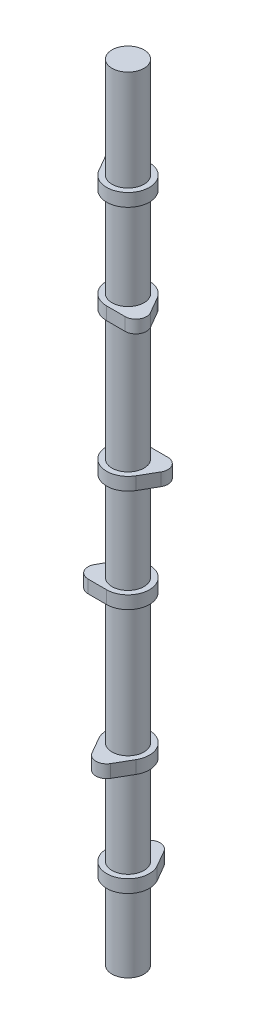
ISO-10303-21;
HEADER;
FILE_DESCRIPTION(('STEP AP214'),'2;1');
FILE_NAME('part.step','',(''),(''),'','','');
FILE_SCHEMA(('AUTOMOTIVE_DESIGN { 1 0 10303 214 1 1 1 1 }'));
ENDSEC;
DATA;
#1=APPLICATION_CONTEXT('core data for automotive mechanical design processes');
#2=APPLICATION_PROTOCOL_DEFINITION('international standard','automotive_design',2000,#1);
#3=PRODUCT_CONTEXT('',#1,'mechanical');
#4=PRODUCT('Part','Part','',(#3));
#5=PRODUCT_RELATED_PRODUCT_CATEGORY('part','',(#4));
#6=PRODUCT_DEFINITION_FORMATION('','',#4);
#7=PRODUCT_DEFINITION_CONTEXT('part definition',#1,'design');
#8=PRODUCT_DEFINITION('design','',#6,#7);
#9=PRODUCT_DEFINITION_SHAPE('','',#8);
#10=(LENGTH_UNIT() NAMED_UNIT(*) SI_UNIT(.MILLI.,.METRE.));
#11=(NAMED_UNIT(*) PLANE_ANGLE_UNIT() SI_UNIT($,.RADIAN.));
#12=(NAMED_UNIT(*) SI_UNIT($,.STERADIAN.) SOLID_ANGLE_UNIT());
#13=UNCERTAINTY_MEASURE_WITH_UNIT(LENGTH_MEASURE(1.E-05),#10,'distance_accuracy_value','');
#14=(GEOMETRIC_REPRESENTATION_CONTEXT(3) GLOBAL_UNCERTAINTY_ASSIGNED_CONTEXT((#13)) GLOBAL_UNIT_ASSIGNED_CONTEXT((#10,
#11,#12)) REPRESENTATION_CONTEXT('',''));
#15=CARTESIAN_POINT('',(0.,0.,0.));
#16=DIRECTION('',(0.,0.,1.));
#17=DIRECTION('',(1.,0.,0.));
#18=AXIS2_PLACEMENT_3D('',#15,#16,#17);
#19=CARTESIAN_POINT('',(0.,64.77,0.));
#20=DIRECTION('',(0.,-1.,0.));
#21=DIRECTION('',(0.,0.,1.));
#22=AXIS2_PLACEMENT_3D('',#19,#20,#21);
#23=CYLINDRICAL_SURFACE('',#22,12.7);
#24=CARTESIAN_POINT('',(0.,57.15,0.));
#25=DIRECTION('',(0.,1.,0.));
#26=DIRECTION('',(0.,0.,-1.));
#27=AXIS2_PLACEMENT_3D('',#24,#25,#26);
#28=CIRCLE('',#27,12.7);
#29=CARTESIAN_POINT('',(10.9985226280623,57.15,6.35000000000008));
#30=VERTEX_POINT('',#29);
#31=CARTESIAN_POINT('',(-10.9985226280624,57.15,6.34999999999992));
#32=VERTEX_POINT('',#31);
#33=EDGE_CURVE('E393',#30,#32,#28,.T.);
#34=ORIENTED_EDGE('',*,*,#33,.T.);
#35=DIRECTION('',(0.,-1.,0.));
#36=VECTOR('',#35,1.);
#37=CARTESIAN_POINT('',(-10.9985226280624,64.77,6.34999999999992));
#38=LINE('',#37,#36);
#39=CARTESIAN_POINT('',(-10.9985226280624,64.77,6.34999999999992));
#40=VERTEX_POINT('',#39);
#41=EDGE_CURVE('E412',#40,#32,#38,.T.);
#42=ORIENTED_EDGE('',*,*,#41,.F.);
#43=CARTESIAN_POINT('',(0.,64.77,0.));
#44=DIRECTION('',(0.,1.,0.));
#45=DIRECTION('',(0.,0.,-1.));
#46=AXIS2_PLACEMENT_3D('',#43,#44,#45);
#47=CIRCLE('',#46,12.7);
#48=CARTESIAN_POINT('',(10.9985226280623,64.77,6.35000000000008));
#49=VERTEX_POINT('',#48);
#50=EDGE_CURVE('E394',#49,#40,#47,.T.);
#51=ORIENTED_EDGE('',*,*,#50,.F.);
#52=DIRECTION('',(0.,-1.,0.));
#53=VECTOR('',#52,1.);
#54=CARTESIAN_POINT('',(10.9985226280623,64.77,6.35000000000008));
#55=LINE('',#54,#53);
#56=EDGE_CURVE('E400',#49,#30,#55,.T.);
#57=ORIENTED_EDGE('',*,*,#56,.T.);
#58=EDGE_LOOP('',(#34,#42,#51,#57));
#59=FACE_BOUND('',#58,.T.);
#60=ADVANCED_FACE('F38',(#59),#23,.T.);
#61=CARTESIAN_POINT('',(-10.9985226280624,64.77,6.34999999999992));
#62=DIRECTION('',(0.866025403784442,0.,-0.499999999999994));
#63=DIRECTION('',(-0.499999999999994,0.,-0.866025403784442));
#64=AXIS2_PLACEMENT_3D('',#61,#62,#63);
#65=PLANE('',#64);
#66=DIRECTION('',(0.499999999999994,0.,0.866025403784442));
#67=VECTOR('',#66,1.);
#68=CARTESIAN_POINT('',(-10.9985226280624,57.15,6.34999999999992));
#69=LINE('',#68,#67);
#70=CARTESIAN_POINT('',(-5.4992613140313,57.15,15.875));
#71=VERTEX_POINT('',#70);
#72=EDGE_CURVE('E403',#32,#71,#69,.T.);
#73=ORIENTED_EDGE('',*,*,#72,.T.);
#74=DIRECTION('',(0.,-1.,0.));
#75=VECTOR('',#74,1.);
#76=CARTESIAN_POINT('',(-5.4992613140313,64.77,15.875));
#77=LINE('',#76,#75);
#78=CARTESIAN_POINT('',(-5.4992613140313,64.77,15.875));
#79=VERTEX_POINT('',#78);
#80=EDGE_CURVE('E410',#79,#71,#77,.T.);
#81=ORIENTED_EDGE('',*,*,#80,.F.);
#82=DIRECTION('',(0.499999999999994,0.,0.866025403784442));
#83=VECTOR('',#82,1.);
#84=CARTESIAN_POINT('',(-10.9985226280624,64.77,6.34999999999992));
#85=LINE('',#84,#83);
#86=EDGE_CURVE('E87',#40,#79,#85,.T.);
#87=ORIENTED_EDGE('',*,*,#86,.F.);
#88=ORIENTED_EDGE('',*,*,#41,.T.);
#89=EDGE_LOOP('',(#73,#81,#87,#88));
#90=FACE_BOUND('',#89,.T.);
#91=ADVANCED_FACE('F431',(#90),#65,.F.);
#92=CARTESIAN_POINT('',(0.,64.77,12.7));
#93=DIRECTION('',(0.,-1.,0.));
#94=DIRECTION('',(0.,0.,1.));
#95=AXIS2_PLACEMENT_3D('',#92,#93,#94);
#96=CYLINDRICAL_SURFACE('',#95,6.35);
#97=CARTESIAN_POINT('',(0.,57.15,12.7));
#98=DIRECTION('',(0.,1.,0.));
#99=DIRECTION('',(0.,0.,-1.));
#100=AXIS2_PLACEMENT_3D('',#97,#98,#99);
#101=CIRCLE('',#100,6.35);
#102=CARTESIAN_POINT('',(5.49926131403107,57.15,15.875));
#103=VERTEX_POINT('',#102);
#104=EDGE_CURVE('E73',#71,#103,#101,.T.);
#105=ORIENTED_EDGE('',*,*,#104,.T.);
#106=DIRECTION('',(0.,-1.,0.));
#107=VECTOR('',#106,1.);
#108=CARTESIAN_POINT('',(5.49926131403107,64.77,15.875));
#109=LINE('',#108,#107);
#110=CARTESIAN_POINT('',(5.49926131403107,64.77,15.875));
#111=VERTEX_POINT('',#110);
#112=EDGE_CURVE('E408',#111,#103,#109,.T.);
#113=ORIENTED_EDGE('',*,*,#112,.F.);
#114=CARTESIAN_POINT('',(0.,64.77,12.7));
#115=DIRECTION('',(0.,1.,0.));
#116=DIRECTION('',(0.,0.,-1.));
#117=AXIS2_PLACEMENT_3D('',#114,#115,#116);
#118=CIRCLE('',#117,6.35);
#119=EDGE_CURVE('E397',#79,#111,#118,.T.);
#120=ORIENTED_EDGE('',*,*,#119,.F.);
#121=ORIENTED_EDGE('',*,*,#80,.T.);
#122=EDGE_LOOP('',(#105,#113,#120,#121));
#123=FACE_BOUND('',#122,.T.);
#124=ADVANCED_FACE('F430',(#123),#96,.T.);
#125=CARTESIAN_POINT('',(10.9985226280623,64.77,6.35000000000008));
#126=DIRECTION('',(-0.866025403784435,0.,-0.500000000000006));
#127=DIRECTION('',(-0.500000000000006,0.,0.866025403784435));
#128=AXIS2_PLACEMENT_3D('',#125,#126,#127);
#129=PLANE('',#128);
#130=DIRECTION('',(0.500000000000006,0.,-0.866025403784435));
#131=VECTOR('',#130,1.);
#132=CARTESIAN_POINT('',(10.9985226280623,57.15,6.35000000000008));
#133=LINE('',#132,#131);
#134=EDGE_CURVE('E79',#103,#30,#133,.T.);
#135=ORIENTED_EDGE('',*,*,#134,.T.);
#136=ORIENTED_EDGE('',*,*,#56,.F.);
#137=DIRECTION('',(0.500000000000006,0.,-0.866025403784435));
#138=VECTOR('',#137,1.);
#139=CARTESIAN_POINT('',(10.9985226280623,64.77,6.35000000000008));
#140=LINE('',#139,#138);
#141=EDGE_CURVE('E55',#111,#49,#140,.T.);
#142=ORIENTED_EDGE('',*,*,#141,.F.);
#143=ORIENTED_EDGE('',*,*,#112,.T.);
#144=EDGE_LOOP('',(#135,#136,#142,#143));
#145=FACE_BOUND('',#144,.T.);
#146=ADVANCED_FACE('F428',(#145),#129,.F.);
#147=CARTESIAN_POINT('',(0.,64.77,0.));
#148=DIRECTION('',(0.,1.,0.));
#149=DIRECTION('',(0.,0.,-1.));
#150=AXIS2_PLACEMENT_3D('',#147,#148,#149);
#151=PLANE('',#150);
#152=CARTESIAN_POINT('',(0.,64.77,0.));
#153=DIRECTION('',(0.,1.,0.));
#154=DIRECTION('',(0.,0.,1.));
#155=AXIS2_PLACEMENT_3D('',#152,#153,#154);
#156=CIRCLE('',#155,9.5);
#157=CARTESIAN_POINT('',(0.,64.77,9.5));
#158=VERTEX_POINT('',#157);
#159=EDGE_CURVE('E390',#158,#158,#156,.F.);
#160=ORIENTED_EDGE('',*,*,#159,.T.);
#161=EDGE_LOOP('',(#160));
#162=FACE_BOUND('',#161,.T.);
#163=ORIENTED_EDGE('',*,*,#50,.T.);
#164=ORIENTED_EDGE('',*,*,#86,.T.);
#165=ORIENTED_EDGE('',*,*,#119,.T.);
#166=ORIENTED_EDGE('',*,*,#141,.T.);
#167=EDGE_LOOP('',(#163,#164,#165,#166));
#168=FACE_BOUND('',#167,.T.);
#169=ADVANCED_FACE('F422',(#162,#168),#151,.T.);
#170=CARTESIAN_POINT('',(0.,57.15,0.));
#171=DIRECTION('',(0.,1.,0.));
#172=DIRECTION('',(0.,0.,-1.));
#173=AXIS2_PLACEMENT_3D('',#170,#171,#172);
#174=PLANE('',#173);
#175=CARTESIAN_POINT('',(0.,57.15,0.));
#176=DIRECTION('',(0.,1.,0.));
#177=DIRECTION('',(0.,0.,1.));
#178=AXIS2_PLACEMENT_3D('',#175,#176,#177);
#179=CIRCLE('',#178,9.5);
#180=CARTESIAN_POINT('',(0.,57.15,9.5));
#181=VERTEX_POINT('',#180);
#182=EDGE_CURVE('E47',#181,#181,#179,.F.);
#183=ORIENTED_EDGE('',*,*,#182,.F.);
#184=EDGE_LOOP('',(#183));
#185=FACE_BOUND('',#184,.T.);
#186=ORIENTED_EDGE('',*,*,#33,.F.);
#187=ORIENTED_EDGE('',*,*,#134,.F.);
#188=ORIENTED_EDGE('',*,*,#104,.F.);
#189=ORIENTED_EDGE('',*,*,#72,.F.);
#190=EDGE_LOOP('',(#186,#187,#188,#189));
#191=FACE_BOUND('',#190,.T.);
#192=ADVANCED_FACE('F419',(#185,#191),#174,.F.);
#193=CARTESIAN_POINT('',(0.,124.46,0.));
#194=DIRECTION('',(0.,-1.,0.));
#195=DIRECTION('',(0.,0.,-1.));
#196=AXIS2_PLACEMENT_3D('',#193,#194,#195);
#197=CYLINDRICAL_SURFACE('',#196,9.5);
#198=CARTESIAN_POINT('',(0.,3.80999999999999,0.));
#199=DIRECTION('',(0.,1.,0.));
#200=DIRECTION('',(0.,0.,1.));
#201=AXIS2_PLACEMENT_3D('',#198,#199,#200);
#202=CIRCLE('',#201,9.5);
#203=CARTESIAN_POINT('',(0.,3.80999999999999,9.5));
#204=VERTEX_POINT('',#203);
#205=EDGE_CURVE('E41',#204,#204,#202,.T.);
#206=ORIENTED_EDGE('',*,*,#205,.T.);
#207=EDGE_LOOP('',(#206));
#208=FACE_BOUND('',#207,.T.);
#209=ORIENTED_EDGE('',*,*,#182,.T.);
#210=EDGE_LOOP('',(#209));
#211=FACE_BOUND('',#210,.T.);
#212=ADVANCED_FACE('F417',(#208,#211),#197,.T.);
#213=ORIENTED_EDGE('',*,*,#159,.F.);
#214=EDGE_LOOP('',(#213));
#215=FACE_BOUND('',#214,.T.);
#216=CARTESIAN_POINT('',(0.,142.24,0.));
#217=DIRECTION('',(0.,1.,0.));
#218=DIRECTION('',(0.866025403784436,0.,-0.500000000000004));
#219=AXIS2_PLACEMENT_3D('',#216,#217,#218);
#220=CIRCLE('',#219,9.5);
#221=CARTESIAN_POINT('',(8.22724133595215,142.24,-4.75000000000004));
#222=VERTEX_POINT('',#221);
#223=EDGE_CURVE('E352',#222,#222,#220,.T.);
#224=ORIENTED_EDGE('',*,*,#223,.F.);
#225=EDGE_LOOP('',(#224));
#226=FACE_BOUND('',#225,.T.);
#227=ADVANCED_FACE('F444',(#215,#226),#197,.T.);
#228=CARTESIAN_POINT('',(0.,3.81,0.));
#229=DIRECTION('',(0.,-1.,0.));
#230=DIRECTION('',(0.,0.,-1.));
#231=AXIS2_PLACEMENT_3D('',#228,#229,#230);
#232=CYLINDRICAL_SURFACE('',#231,12.7);
#233=CARTESIAN_POINT('',(0.,-3.81,0.));
#234=DIRECTION('',(0.,1.,0.));
#235=DIRECTION('',(0.,0.,1.));
#236=AXIS2_PLACEMENT_3D('',#233,#234,#235);
#237=CIRCLE('',#236,12.7);
#238=CARTESIAN_POINT('',(-10.9985226280624,-3.81,-6.35));
#239=VERTEX_POINT('',#238);
#240=CARTESIAN_POINT('',(10.9985226280624,-3.81,-6.35));
#241=VERTEX_POINT('',#240);
#242=EDGE_CURVE('E360',#239,#241,#237,.T.);
#243=ORIENTED_EDGE('',*,*,#242,.T.);
#244=DIRECTION('',(0.,-1.,0.));
#245=VECTOR('',#244,1.);
#246=CARTESIAN_POINT('',(10.9985226280624,3.81,-6.35));
#247=LINE('',#246,#245);
#248=CARTESIAN_POINT('',(10.9985226280624,3.81,-6.35));
#249=VERTEX_POINT('',#248);
#250=EDGE_CURVE('E387',#249,#241,#247,.T.);
#251=ORIENTED_EDGE('',*,*,#250,.F.);
#252=CARTESIAN_POINT('',(0.,3.81,0.));
#253=DIRECTION('',(0.,1.,0.));
#254=DIRECTION('',(0.,0.,1.));
#255=AXIS2_PLACEMENT_3D('',#252,#253,#254);
#256=CIRCLE('',#255,12.7);
#257=CARTESIAN_POINT('',(-10.9985226280624,3.81,-6.35));
#258=VERTEX_POINT('',#257);
#259=EDGE_CURVE('E361',#258,#249,#256,.T.);
#260=ORIENTED_EDGE('',*,*,#259,.F.);
#261=DIRECTION('',(0.,-1.,0.));
#262=VECTOR('',#261,1.);
#263=CARTESIAN_POINT('',(-10.9985226280624,3.81,-6.35));
#264=LINE('',#263,#262);
#265=EDGE_CURVE('E371',#258,#239,#264,.T.);
#266=ORIENTED_EDGE('',*,*,#265,.T.);
#267=EDGE_LOOP('',(#243,#251,#260,#266));
#268=FACE_BOUND('',#267,.T.);
#269=ADVANCED_FACE('F447',(#268),#232,.T.);
#270=CARTESIAN_POINT('',(10.9985226280624,3.81,-6.35));
#271=DIRECTION('',(-0.866025403784439,0.,0.5));
#272=DIRECTION('',(0.5,0.,0.866025403784439));
#273=AXIS2_PLACEMENT_3D('',#270,#271,#272);
#274=PLANE('',#273);
#275=DIRECTION('',(-0.5,0.,-0.866025403784439));
#276=VECTOR('',#275,1.);
#277=CARTESIAN_POINT('',(10.9985226280624,-3.81,-6.35));
#278=LINE('',#277,#276);
#279=CARTESIAN_POINT('',(5.49926131403118,-3.81,-15.875));
#280=VERTEX_POINT('',#279);
#281=EDGE_CURVE('E374',#241,#280,#278,.T.);
#282=ORIENTED_EDGE('',*,*,#281,.T.);
#283=DIRECTION('',(0.,-1.,0.));
#284=VECTOR('',#283,1.);
#285=CARTESIAN_POINT('',(5.49926131403118,3.81,-15.875));
#286=LINE('',#285,#284);
#287=CARTESIAN_POINT('',(5.49926131403118,3.81,-15.875));
#288=VERTEX_POINT('',#287);
#289=EDGE_CURVE('E384',#288,#280,#286,.T.);
#290=ORIENTED_EDGE('',*,*,#289,.F.);
#291=DIRECTION('',(-0.5,0.,-0.866025403784439));
#292=VECTOR('',#291,1.);
#293=CARTESIAN_POINT('',(10.9985226280624,3.81,-6.35));
#294=LINE('',#293,#292);
#295=EDGE_CURVE('E364',#249,#288,#294,.T.);
#296=ORIENTED_EDGE('',*,*,#295,.F.);
#297=ORIENTED_EDGE('',*,*,#250,.T.);
#298=EDGE_LOOP('',(#282,#290,#296,#297));
#299=FACE_BOUND('',#298,.T.);
#300=ADVANCED_FACE('F452',(#299),#274,.F.);
#301=CARTESIAN_POINT('',(0.,3.81,-12.7));
#302=DIRECTION('',(0.,-1.,0.));
#303=DIRECTION('',(0.,0.,-1.));
#304=AXIS2_PLACEMENT_3D('',#301,#302,#303);
#305=CYLINDRICAL_SURFACE('',#304,6.35);
#306=CARTESIAN_POINT('',(0.,-3.81,-12.7));
#307=DIRECTION('',(0.,1.,0.));
#308=DIRECTION('',(0.,0.,1.));
#309=AXIS2_PLACEMENT_3D('',#306,#307,#308);
#310=CIRCLE('',#309,6.35);
#311=CARTESIAN_POINT('',(-5.49926131403118,-3.81,-15.875));
#312=VERTEX_POINT('',#311);
#313=EDGE_CURVE('E376',#280,#312,#310,.T.);
#314=ORIENTED_EDGE('',*,*,#313,.T.);
#315=DIRECTION('',(0.,-1.,0.));
#316=VECTOR('',#315,1.);
#317=CARTESIAN_POINT('',(-5.49926131403118,3.81,-15.875));
#318=LINE('',#317,#316);
#319=CARTESIAN_POINT('',(-5.49926131403118,3.81,-15.875));
#320=VERTEX_POINT('',#319);
#321=EDGE_CURVE('E381',#320,#312,#318,.T.);
#322=ORIENTED_EDGE('',*,*,#321,.F.);
#323=CARTESIAN_POINT('',(0.,3.81,-12.7));
#324=DIRECTION('',(0.,1.,0.));
#325=DIRECTION('',(0.,0.,1.));
#326=AXIS2_PLACEMENT_3D('',#323,#324,#325);
#327=CIRCLE('',#326,6.35);
#328=EDGE_CURVE('E367',#288,#320,#327,.T.);
#329=ORIENTED_EDGE('',*,*,#328,.F.);
#330=ORIENTED_EDGE('',*,*,#289,.T.);
#331=EDGE_LOOP('',(#314,#322,#329,#330));
#332=FACE_BOUND('',#331,.T.);
#333=ADVANCED_FACE('F456',(#332),#305,.T.);
#334=CARTESIAN_POINT('',(-10.9985226280624,3.81,-6.35));
#335=DIRECTION('',(0.866025403784439,0.,0.5));
#336=DIRECTION('',(0.5,0.,-0.866025403784439));
#337=AXIS2_PLACEMENT_3D('',#334,#335,#336);
#338=PLANE('',#337);
#339=DIRECTION('',(-0.5,0.,0.866025403784439));
#340=VECTOR('',#339,1.);
#341=CARTESIAN_POINT('',(-10.9985226280624,-3.81,-6.35));
#342=LINE('',#341,#340);
#343=EDGE_CURVE('E365',#312,#239,#342,.T.);
#344=ORIENTED_EDGE('',*,*,#343,.T.);
#345=ORIENTED_EDGE('',*,*,#265,.F.);
#346=DIRECTION('',(-0.5,0.,0.866025403784439));
#347=VECTOR('',#346,1.);
#348=CARTESIAN_POINT('',(-10.9985226280624,3.81,-6.35));
#349=LINE('',#348,#347);
#350=EDGE_CURVE('E369',#320,#258,#349,.T.);
#351=ORIENTED_EDGE('',*,*,#350,.F.);
#352=ORIENTED_EDGE('',*,*,#321,.T.);
#353=EDGE_LOOP('',(#344,#345,#351,#352));
#354=FACE_BOUND('',#353,.T.);
#355=ADVANCED_FACE('F460',(#354),#338,.F.);
#356=CARTESIAN_POINT('',(0.,3.81,0.));
#357=DIRECTION('',(0.,1.,0.));
#358=DIRECTION('',(0.,0.,1.));
#359=AXIS2_PLACEMENT_3D('',#356,#357,#358);
#360=PLANE('',#359);
#361=ORIENTED_EDGE('',*,*,#205,.F.);
#362=EDGE_LOOP('',(#361));
#363=FACE_BOUND('',#362,.T.);
#364=ORIENTED_EDGE('',*,*,#259,.T.);
#365=ORIENTED_EDGE('',*,*,#295,.T.);
#366=ORIENTED_EDGE('',*,*,#328,.T.);
#367=ORIENTED_EDGE('',*,*,#350,.T.);
#368=EDGE_LOOP('',(#364,#365,#366,#367));
#369=FACE_BOUND('',#368,.T.);
#370=ADVANCED_FACE('F464',(#363,#369),#360,.T.);
#371=CARTESIAN_POINT('',(0.,-3.81,0.));
#372=DIRECTION('',(0.,1.,0.));
#373=DIRECTION('',(0.,0.,1.));
#374=AXIS2_PLACEMENT_3D('',#371,#372,#373);
#375=PLANE('',#374);
#376=CARTESIAN_POINT('',(0.,-3.81000000000001,0.));
#377=DIRECTION('',(0.,1.,0.));
#378=DIRECTION('',(0.,0.,1.));
#379=AXIS2_PLACEMENT_3D('',#376,#377,#378);
#380=CIRCLE('',#379,9.5);
#381=CARTESIAN_POINT('',(0.,-3.81000000000001,9.5));
#382=VERTEX_POINT('',#381);
#383=EDGE_CURVE('E11',#382,#382,#380,.T.);
#384=ORIENTED_EDGE('',*,*,#383,.T.);
#385=EDGE_LOOP('',(#384));
#386=FACE_BOUND('',#385,.T.);
#387=ORIENTED_EDGE('',*,*,#242,.F.);
#388=ORIENTED_EDGE('',*,*,#343,.F.);
#389=ORIENTED_EDGE('',*,*,#313,.F.);
#390=ORIENTED_EDGE('',*,*,#281,.F.);
#391=EDGE_LOOP('',(#387,#388,#389,#390));
#392=FACE_BOUND('',#391,.T.);
#393=ADVANCED_FACE('F466',(#386,#392),#375,.F.);
#394=ORIENTED_EDGE('',*,*,#383,.F.);
#395=EDGE_LOOP('',(#394));
#396=FACE_BOUND('',#395,.T.);
#397=CARTESIAN_POINT('',(0.,-49.53,0.));
#398=DIRECTION('',(0.,-1.,0.));
#399=DIRECTION('',(0.,0.,-1.));
#400=AXIS2_PLACEMENT_3D('',#397,#398,#399);
#401=CIRCLE('',#400,9.5);
#402=CARTESIAN_POINT('',(0.,-49.53,-9.5));
#403=VERTEX_POINT('',#402);
#404=EDGE_CURVE('E355',#403,#403,#401,.T.);
#405=ORIENTED_EDGE('',*,*,#404,.F.);
#406=EDGE_LOOP('',(#405));
#407=FACE_BOUND('',#406,.T.);
#408=ADVANCED_FACE('F449',(#396,#407),#197,.T.);
#409=CARTESIAN_POINT('',(0.,-49.53,0.));
#410=DIRECTION('',(0.,-1.,0.));
#411=DIRECTION('',(0.,0.,-1.));
#412=AXIS2_PLACEMENT_3D('',#409,#410,#411);
#413=PLANE('',#412);
#414=ORIENTED_EDGE('',*,*,#404,.T.);
#415=EDGE_LOOP('',(#414));
#416=FACE_BOUND('',#415,.T.);
#417=ADVANCED_FACE('F473',(#416),#413,.T.);
#418=CARTESIAN_POINT('',(0.,210.82,0.));
#419=DIRECTION('',(0.,-1.,0.));
#420=DIRECTION('',(0.86602540378444,0.,-0.499999999999998));
#421=AXIS2_PLACEMENT_3D('',#418,#419,#420);
#422=CYLINDRICAL_SURFACE('',#421,12.7);
#423=CARTESIAN_POINT('',(0.,203.2,0.));
#424=DIRECTION('',(0.,1.,0.));
#425=DIRECTION('',(-0.86602540378444,0.,0.499999999999998));
#426=AXIS2_PLACEMENT_3D('',#423,#424,#425);
#427=CIRCLE('',#426,12.7);
#428=CARTESIAN_POINT('',(0.,203.2,-12.7));
#429=VERTEX_POINT('',#428);
#430=CARTESIAN_POINT('',(10.9985226280624,203.2,6.35000000000002));
#431=VERTEX_POINT('',#430);
#432=EDGE_CURVE('E319',#429,#431,#427,.T.);
#433=ORIENTED_EDGE('',*,*,#432,.T.);
#434=DIRECTION('',(0.,-1.,0.));
#435=VECTOR('',#434,1.);
#436=CARTESIAN_POINT('',(10.9985226280624,210.82,6.35000000000002));
#437=LINE('',#436,#435);
#438=CARTESIAN_POINT('',(10.9985226280624,210.82,6.35000000000002));
#439=VERTEX_POINT('',#438);
#440=EDGE_CURVE('E346',#439,#431,#437,.T.);
#441=ORIENTED_EDGE('',*,*,#440,.F.);
#442=CARTESIAN_POINT('',(0.,210.82,0.));
#443=DIRECTION('',(0.,1.,0.));
#444=DIRECTION('',(-0.86602540378444,0.,0.499999999999998));
#445=AXIS2_PLACEMENT_3D('',#442,#443,#444);
#446=CIRCLE('',#445,12.7);
#447=CARTESIAN_POINT('',(0.,210.82,-12.7));
#448=VERTEX_POINT('',#447);
#449=EDGE_CURVE('E320',#448,#439,#446,.T.);
#450=ORIENTED_EDGE('',*,*,#449,.F.);
#451=DIRECTION('',(0.,-1.,0.));
#452=VECTOR('',#451,1.);
#453=CARTESIAN_POINT('',(0.,210.82,-12.7));
#454=LINE('',#453,#452);
#455=EDGE_CURVE('E330',#448,#429,#454,.T.);
#456=ORIENTED_EDGE('',*,*,#455,.T.);
#457=EDGE_LOOP('',(#433,#441,#450,#456));
#458=FACE_BOUND('',#457,.T.);
#459=ADVANCED_FACE('F476',(#458),#422,.T.);
#460=CARTESIAN_POINT('',(10.9985226280624,210.82,6.35000000000002));
#461=DIRECTION('',(-0.866025403784437,0.,-0.500000000000002));
#462=DIRECTION('',(-0.500000000000002,0.,0.866025403784437));
#463=AXIS2_PLACEMENT_3D('',#460,#461,#462);
#464=PLANE('',#463);
#465=DIRECTION('',(0.500000000000002,0.,-0.866025403784437));
#466=VECTOR('',#465,1.);
#467=CARTESIAN_POINT('',(10.9985226280624,203.2,6.35000000000002));
#468=LINE('',#467,#466);
#469=CARTESIAN_POINT('',(16.4977839420936,203.2,-3.17499999999996));
#470=VERTEX_POINT('',#469);
#471=EDGE_CURVE('E333',#431,#470,#468,.T.);
#472=ORIENTED_EDGE('',*,*,#471,.T.);
#473=DIRECTION('',(0.,-1.,0.));
#474=VECTOR('',#473,1.);
#475=CARTESIAN_POINT('',(16.4977839420936,210.82,-3.17499999999996));
#476=LINE('',#475,#474);
#477=CARTESIAN_POINT('',(16.4977839420936,210.82,-3.17499999999996));
#478=VERTEX_POINT('',#477);
#479=EDGE_CURVE('E343',#478,#470,#476,.T.);
#480=ORIENTED_EDGE('',*,*,#479,.F.);
#481=DIRECTION('',(0.500000000000002,0.,-0.866025403784437));
#482=VECTOR('',#481,1.);
#483=CARTESIAN_POINT('',(10.9985226280624,210.82,6.35000000000002));
#484=LINE('',#483,#482);
#485=EDGE_CURVE('E323',#439,#478,#484,.T.);
#486=ORIENTED_EDGE('',*,*,#485,.F.);
#487=ORIENTED_EDGE('',*,*,#440,.T.);
#488=EDGE_LOOP('',(#472,#480,#486,#487));
#489=FACE_BOUND('',#488,.T.);
#490=ADVANCED_FACE('F480',(#489),#464,.F.);
#491=CARTESIAN_POINT('',(10.9985226280624,210.82,-6.34999999999997));
#492=DIRECTION('',(0.,-1.,0.));
#493=DIRECTION('',(0.86602540378444,0.,-0.499999999999998));
#494=AXIS2_PLACEMENT_3D('',#491,#492,#493);
#495=CYLINDRICAL_SURFACE('',#494,6.35);
#496=CARTESIAN_POINT('',(10.9985226280624,203.2,-6.34999999999997));
#497=DIRECTION('',(0.,1.,0.));
#498=DIRECTION('',(-0.86602540378444,0.,0.499999999999998));
#499=AXIS2_PLACEMENT_3D('',#496,#497,#498);
#500=CIRCLE('',#499,6.35);
#501=CARTESIAN_POINT('',(10.9985226280624,203.2,-12.7));
#502=VERTEX_POINT('',#501);
#503=EDGE_CURVE('E335',#470,#502,#500,.T.);
#504=ORIENTED_EDGE('',*,*,#503,.T.);
#505=DIRECTION('',(0.,-1.,0.));
#506=VECTOR('',#505,1.);
#507=CARTESIAN_POINT('',(10.9985226280624,210.82,-12.7));
#508=LINE('',#507,#506);
#509=CARTESIAN_POINT('',(10.9985226280624,210.82,-12.7));
#510=VERTEX_POINT('',#509);
#511=EDGE_CURVE('E340',#510,#502,#508,.T.);
#512=ORIENTED_EDGE('',*,*,#511,.F.);
#513=CARTESIAN_POINT('',(10.9985226280624,210.82,-6.34999999999997));
#514=DIRECTION('',(0.,1.,0.));
#515=DIRECTION('',(-0.86602540378444,0.,0.499999999999998));
#516=AXIS2_PLACEMENT_3D('',#513,#514,#515);
#517=CIRCLE('',#516,6.35);
#518=EDGE_CURVE('E326',#478,#510,#517,.T.);
#519=ORIENTED_EDGE('',*,*,#518,.F.);
#520=ORIENTED_EDGE('',*,*,#479,.T.);
#521=EDGE_LOOP('',(#504,#512,#519,#520));
#522=FACE_BOUND('',#521,.T.);
#523=ADVANCED_FACE('F484',(#522),#495,.T.);
#524=CARTESIAN_POINT('',(0.,210.82,-12.7));
#525=DIRECTION('',(0.,0.,1.));
#526=DIRECTION('',(1.,0.,0.));
#527=AXIS2_PLACEMENT_3D('',#524,#525,#526);
#528=PLANE('',#527);
#529=DIRECTION('',(-1.,0.,0.));
#530=VECTOR('',#529,1.);
#531=CARTESIAN_POINT('',(0.,203.2,-12.7));
#532=LINE('',#531,#530);
#533=EDGE_CURVE('E324',#502,#429,#532,.T.);
#534=ORIENTED_EDGE('',*,*,#533,.T.);
#535=ORIENTED_EDGE('',*,*,#455,.F.);
#536=DIRECTION('',(-1.,0.,0.));
#537=VECTOR('',#536,1.);
#538=CARTESIAN_POINT('',(0.,210.82,-12.7));
#539=LINE('',#538,#537);
#540=EDGE_CURVE('E328',#510,#448,#539,.T.);
#541=ORIENTED_EDGE('',*,*,#540,.F.);
#542=ORIENTED_EDGE('',*,*,#511,.T.);
#543=EDGE_LOOP('',(#534,#535,#541,#542));
#544=FACE_BOUND('',#543,.T.);
#545=ADVANCED_FACE('F488',(#544),#528,.F.);
#546=CARTESIAN_POINT('',(0.,210.82,0.));
#547=DIRECTION('',(0.,1.,0.));
#548=DIRECTION('',(-0.86602540378444,0.,0.499999999999998));
#549=AXIS2_PLACEMENT_3D('',#546,#547,#548);
#550=PLANE('',#549);
#551=CARTESIAN_POINT('',(0.,210.82,0.));
#552=DIRECTION('',(0.,1.,0.));
#553=DIRECTION('',(0.866025403784436,0.,-0.500000000000004));
#554=AXIS2_PLACEMENT_3D('',#551,#552,#553);
#555=CIRCLE('',#554,9.5);
#556=CARTESIAN_POINT('',(8.22724133595215,210.82,-4.75000000000004));
#557=VERTEX_POINT('',#556);
#558=EDGE_CURVE('E316',#557,#557,#555,.F.);
#559=ORIENTED_EDGE('',*,*,#558,.T.);
#560=EDGE_LOOP('',(#559));
#561=FACE_BOUND('',#560,.T.);
#562=ORIENTED_EDGE('',*,*,#449,.T.);
#563=ORIENTED_EDGE('',*,*,#485,.T.);
#564=ORIENTED_EDGE('',*,*,#518,.T.);
#565=ORIENTED_EDGE('',*,*,#540,.T.);
#566=EDGE_LOOP('',(#562,#563,#564,#565));
#567=FACE_BOUND('',#566,.T.);
#568=ADVANCED_FACE('F492',(#561,#567),#550,.T.);
#569=CARTESIAN_POINT('',(0.,203.2,0.));
#570=DIRECTION('',(0.,1.,0.));
#571=DIRECTION('',(-0.86602540378444,0.,0.499999999999998));
#572=AXIS2_PLACEMENT_3D('',#569,#570,#571);
#573=PLANE('',#572);
#574=CARTESIAN_POINT('',(0.,203.2,0.));
#575=DIRECTION('',(0.,1.,0.));
#576=DIRECTION('',(0.866025403784436,0.,-0.500000000000004));
#577=AXIS2_PLACEMENT_3D('',#574,#575,#576);
#578=CIRCLE('',#577,9.5);
#579=CARTESIAN_POINT('',(8.22724133595215,203.2,-4.75000000000004));
#580=VERTEX_POINT('',#579);
#581=EDGE_CURVE('E349',#580,#580,#578,.F.);
#582=ORIENTED_EDGE('',*,*,#581,.F.);
#583=EDGE_LOOP('',(#582));
#584=FACE_BOUND('',#583,.T.);
#585=ORIENTED_EDGE('',*,*,#432,.F.);
#586=ORIENTED_EDGE('',*,*,#533,.F.);
#587=ORIENTED_EDGE('',*,*,#503,.F.);
#588=ORIENTED_EDGE('',*,*,#471,.F.);
#589=EDGE_LOOP('',(#585,#586,#587,#588));
#590=FACE_BOUND('',#589,.T.);
#591=ADVANCED_FACE('F494',(#584,#590),#573,.F.);
#592=CARTESIAN_POINT('',(0.,270.51,0.));
#593=DIRECTION('',(0.,-1.,0.));
#594=DIRECTION('',(-0.866025403784436,0.,0.500000000000004));
#595=AXIS2_PLACEMENT_3D('',#592,#593,#594);
#596=CYLINDRICAL_SURFACE('',#595,9.5);
#597=CARTESIAN_POINT('',(0.,149.86,0.));
#598=DIRECTION('',(0.,1.,0.));
#599=DIRECTION('',(0.866025403784436,0.,-0.500000000000004));
#600=AXIS2_PLACEMENT_3D('',#597,#598,#599);
#601=CIRCLE('',#600,9.5);
#602=CARTESIAN_POINT('',(8.22724133595215,149.86,-4.75000000000004));
#603=VERTEX_POINT('',#602);
#604=EDGE_CURVE('E315',#603,#603,#601,.T.);
#605=ORIENTED_EDGE('',*,*,#604,.T.);
#606=EDGE_LOOP('',(#605));
#607=FACE_BOUND('',#606,.T.);
#608=ORIENTED_EDGE('',*,*,#581,.T.);
#609=EDGE_LOOP('',(#608));
#610=FACE_BOUND('',#609,.T.);
#611=ADVANCED_FACE('F497',(#607,#610),#596,.T.);
#612=ORIENTED_EDGE('',*,*,#558,.F.);
#613=EDGE_LOOP('',(#612));
#614=FACE_BOUND('',#613,.T.);
#615=CARTESIAN_POINT('',(0.,288.29,0.));
#616=DIRECTION('',(0.,1.,0.));
#617=DIRECTION('',(-0.866025403784436,0.,-0.500000000000004));
#618=AXIS2_PLACEMENT_3D('',#615,#616,#617);
#619=CIRCLE('',#618,9.5);
#620=CARTESIAN_POINT('',(-8.22724133595215,288.29,-4.75000000000004));
#621=VERTEX_POINT('',#620);
#622=EDGE_CURVE('E282',#621,#621,#619,.T.);
#623=ORIENTED_EDGE('',*,*,#622,.F.);
#624=EDGE_LOOP('',(#623));
#625=FACE_BOUND('',#624,.T.);
#626=ADVANCED_FACE('F502',(#614,#625),#596,.T.);
#627=CARTESIAN_POINT('',(0.,149.86,0.));
#628=DIRECTION('',(0.,-1.,0.));
#629=DIRECTION('',(-0.866025403784436,0.,0.500000000000004));
#630=AXIS2_PLACEMENT_3D('',#627,#628,#629);
#631=CYLINDRICAL_SURFACE('',#630,12.7);
#632=CARTESIAN_POINT('',(0.,142.24,0.));
#633=DIRECTION('',(0.,1.,0.));
#634=DIRECTION('',(0.866025403784436,0.,-0.500000000000004));
#635=AXIS2_PLACEMENT_3D('',#632,#633,#634);
#636=CIRCLE('',#635,12.7);
#637=CARTESIAN_POINT('',(0.,142.24,12.7));
#638=VERTEX_POINT('',#637);
#639=CARTESIAN_POINT('',(-10.9985226280624,142.24,-6.34999999999995));
#640=VERTEX_POINT('',#639);
#641=EDGE_CURVE('E284',#638,#640,#636,.T.);
#642=ORIENTED_EDGE('',*,*,#641,.T.);
#643=DIRECTION('',(0.,-1.,0.));
#644=VECTOR('',#643,1.);
#645=CARTESIAN_POINT('',(-10.9985226280624,149.86,-6.34999999999995));
#646=LINE('',#645,#644);
#647=CARTESIAN_POINT('',(-10.9985226280624,149.86,-6.34999999999995));
#648=VERTEX_POINT('',#647);
#649=EDGE_CURVE('E312',#648,#640,#646,.T.);
#650=ORIENTED_EDGE('',*,*,#649,.F.);
#651=CARTESIAN_POINT('',(0.,149.86,0.));
#652=DIRECTION('',(0.,1.,0.));
#653=DIRECTION('',(0.866025403784436,0.,-0.500000000000004));
#654=AXIS2_PLACEMENT_3D('',#651,#652,#653);
#655=CIRCLE('',#654,12.7);
#656=CARTESIAN_POINT('',(0.,149.86,12.7));
#657=VERTEX_POINT('',#656);
#658=EDGE_CURVE('E286',#657,#648,#655,.T.);
#659=ORIENTED_EDGE('',*,*,#658,.F.);
#660=DIRECTION('',(0.,-1.,0.));
#661=VECTOR('',#660,1.);
#662=CARTESIAN_POINT('',(0.,149.86,12.7));
#663=LINE('',#662,#661);
#664=EDGE_CURVE('E296',#657,#638,#663,.T.);
#665=ORIENTED_EDGE('',*,*,#664,.T.);
#666=EDGE_LOOP('',(#642,#650,#659,#665));
#667=FACE_BOUND('',#666,.T.);
#668=ADVANCED_FACE('F505',(#667),#631,.T.);
#669=CARTESIAN_POINT('',(-10.9985226280624,149.86,-6.34999999999995));
#670=DIRECTION('',(0.866025403784441,0.,0.499999999999996));
#671=DIRECTION('',(0.499999999999996,0.,-0.866025403784441));
#672=AXIS2_PLACEMENT_3D('',#669,#670,#671);
#673=PLANE('',#672);
#674=DIRECTION('',(-0.499999999999996,0.,0.866025403784441));
#675=VECTOR('',#674,1.);
#676=CARTESIAN_POINT('',(-10.9985226280624,142.24,-6.34999999999995));
#677=LINE('',#676,#675);
#678=CARTESIAN_POINT('',(-16.4977839420935,142.24,3.17500000000008));
#679=VERTEX_POINT('',#678);
#680=EDGE_CURVE('E299',#640,#679,#677,.T.);
#681=ORIENTED_EDGE('',*,*,#680,.T.);
#682=DIRECTION('',(0.,-1.,0.));
#683=VECTOR('',#682,1.);
#684=CARTESIAN_POINT('',(-16.4977839420935,149.86,3.17500000000008));
#685=LINE('',#684,#683);
#686=CARTESIAN_POINT('',(-16.4977839420935,149.86,3.17500000000008));
#687=VERTEX_POINT('',#686);
#688=EDGE_CURVE('E309',#687,#679,#685,.T.);
#689=ORIENTED_EDGE('',*,*,#688,.F.);
#690=DIRECTION('',(-0.499999999999996,0.,0.866025403784441));
#691=VECTOR('',#690,1.);
#692=CARTESIAN_POINT('',(-10.9985226280624,149.86,-6.34999999999995));
#693=LINE('',#692,#691);
#694=EDGE_CURVE('E289',#648,#687,#693,.T.);
#695=ORIENTED_EDGE('',*,*,#694,.F.);
#696=ORIENTED_EDGE('',*,*,#649,.T.);
#697=EDGE_LOOP('',(#681,#689,#695,#696));
#698=FACE_BOUND('',#697,.T.);
#699=ADVANCED_FACE('F509',(#698),#673,.F.);
#700=CARTESIAN_POINT('',(-10.9985226280623,149.86,6.35000000000005));
#701=DIRECTION('',(0.,-1.,0.));
#702=DIRECTION('',(-0.866025403784436,0.,0.500000000000004));
#703=AXIS2_PLACEMENT_3D('',#700,#701,#702);
#704=CYLINDRICAL_SURFACE('',#703,6.35);
#705=CARTESIAN_POINT('',(-10.9985226280623,142.24,6.35000000000005));
#706=DIRECTION('',(0.,1.,0.));
#707=DIRECTION('',(0.866025403784436,0.,-0.500000000000004));
#708=AXIS2_PLACEMENT_3D('',#705,#706,#707);
#709=CIRCLE('',#708,6.35);
#710=CARTESIAN_POINT('',(-10.9985226280623,142.24,12.7000000000001));
#711=VERTEX_POINT('',#710);
#712=EDGE_CURVE('E301',#679,#711,#709,.T.);
#713=ORIENTED_EDGE('',*,*,#712,.T.);
#714=DIRECTION('',(0.,-1.,0.));
#715=VECTOR('',#714,1.);
#716=CARTESIAN_POINT('',(-10.9985226280623,149.86,12.7000000000001));
#717=LINE('',#716,#715);
#718=CARTESIAN_POINT('',(-10.9985226280623,149.86,12.7000000000001));
#719=VERTEX_POINT('',#718);
#720=EDGE_CURVE('E306',#719,#711,#717,.T.);
#721=ORIENTED_EDGE('',*,*,#720,.F.);
#722=CARTESIAN_POINT('',(-10.9985226280623,149.86,6.35000000000005));
#723=DIRECTION('',(0.,1.,0.));
#724=DIRECTION('',(0.866025403784436,0.,-0.500000000000004));
#725=AXIS2_PLACEMENT_3D('',#722,#723,#724);
#726=CIRCLE('',#725,6.35);
#727=EDGE_CURVE('E292',#687,#719,#726,.T.);
#728=ORIENTED_EDGE('',*,*,#727,.F.);
#729=ORIENTED_EDGE('',*,*,#688,.T.);
#730=EDGE_LOOP('',(#713,#721,#728,#729));
#731=FACE_BOUND('',#730,.T.);
#732=ADVANCED_FACE('F513',(#731),#704,.T.);
#733=CARTESIAN_POINT('',(0.,149.86,12.7));
#734=DIRECTION('',(0.,0.,-1.));
#735=DIRECTION('',(-1.,0.,0.));
#736=AXIS2_PLACEMENT_3D('',#733,#734,#735);
#737=PLANE('',#736);
#738=DIRECTION('',(1.,0.,0.));
#739=VECTOR('',#738,1.);
#740=CARTESIAN_POINT('',(0.,142.24,12.7));
#741=LINE('',#740,#739);
#742=EDGE_CURVE('E290',#711,#638,#741,.T.);
#743=ORIENTED_EDGE('',*,*,#742,.T.);
#744=ORIENTED_EDGE('',*,*,#664,.F.);
#745=DIRECTION('',(1.,0.,0.));
#746=VECTOR('',#745,1.);
#747=CARTESIAN_POINT('',(0.,149.86,12.7));
#748=LINE('',#747,#746);
#749=EDGE_CURVE('E294',#719,#657,#748,.T.);
#750=ORIENTED_EDGE('',*,*,#749,.F.);
#751=ORIENTED_EDGE('',*,*,#720,.T.);
#752=EDGE_LOOP('',(#743,#744,#750,#751));
#753=FACE_BOUND('',#752,.T.);
#754=ADVANCED_FACE('F517',(#753),#737,.F.);
#755=CARTESIAN_POINT('',(0.,149.86,0.));
#756=DIRECTION('',(0.,1.,0.));
#757=DIRECTION('',(0.866025403784436,0.,-0.500000000000004));
#758=AXIS2_PLACEMENT_3D('',#755,#756,#757);
#759=PLANE('',#758);
#760=ORIENTED_EDGE('',*,*,#604,.F.);
#761=EDGE_LOOP('',(#760));
#762=FACE_BOUND('',#761,.T.);
#763=ORIENTED_EDGE('',*,*,#658,.T.);
#764=ORIENTED_EDGE('',*,*,#694,.T.);
#765=ORIENTED_EDGE('',*,*,#727,.T.);
#766=ORIENTED_EDGE('',*,*,#749,.T.);
#767=EDGE_LOOP('',(#763,#764,#765,#766));
#768=FACE_BOUND('',#767,.T.);
#769=ADVANCED_FACE('F521',(#762,#768),#759,.T.);
#770=CARTESIAN_POINT('',(0.,142.24,0.));
#771=DIRECTION('',(0.,1.,0.));
#772=DIRECTION('',(0.866025403784436,0.,-0.500000000000004));
#773=AXIS2_PLACEMENT_3D('',#770,#771,#772);
#774=PLANE('',#773);
#775=ORIENTED_EDGE('',*,*,#223,.T.);
#776=EDGE_LOOP('',(#775));
#777=FACE_BOUND('',#776,.T.);
#778=ORIENTED_EDGE('',*,*,#641,.F.);
#779=ORIENTED_EDGE('',*,*,#742,.F.);
#780=ORIENTED_EDGE('',*,*,#712,.F.);
#781=ORIENTED_EDGE('',*,*,#680,.F.);
#782=EDGE_LOOP('',(#778,#779,#780,#781));
#783=FACE_BOUND('',#782,.T.);
#784=ADVANCED_FACE('F523',(#777,#783),#774,.F.);
#785=CARTESIAN_POINT('',(0.,356.87,0.));
#786=DIRECTION('',(0.,-1.,0.));
#787=DIRECTION('',(-0.866025403784433,0.,-0.50000000000001));
#788=AXIS2_PLACEMENT_3D('',#785,#786,#787);
#789=CYLINDRICAL_SURFACE('',#788,12.7);
#790=CARTESIAN_POINT('',(0.,349.25,0.));
#791=DIRECTION('',(0.,1.,0.));
#792=DIRECTION('',(0.866025403784433,0.,0.50000000000001));
#793=AXIS2_PLACEMENT_3D('',#790,#791,#792);
#794=CIRCLE('',#793,12.7);
#795=CARTESIAN_POINT('',(-10.9985226280624,349.25,6.34999999999987));
#796=VERTEX_POINT('',#795);
#797=CARTESIAN_POINT('',(1.48318857196017E-13,349.25,-12.7));
#798=VERTEX_POINT('',#797);
#799=EDGE_CURVE('E249',#796,#798,#794,.T.);
#800=ORIENTED_EDGE('',*,*,#799,.T.);
#801=DIRECTION('',(0.,-1.,0.));
#802=VECTOR('',#801,1.);
#803=CARTESIAN_POINT('',(1.48318857196017E-13,356.87,-12.7));
#804=LINE('',#803,#802);
#805=CARTESIAN_POINT('',(1.48318857196017E-13,356.87,-12.7));
#806=VERTEX_POINT('',#805);
#807=EDGE_CURVE('E276',#806,#798,#804,.T.);
#808=ORIENTED_EDGE('',*,*,#807,.F.);
#809=CARTESIAN_POINT('',(0.,356.87,0.));
#810=DIRECTION('',(0.,1.,0.));
#811=DIRECTION('',(0.866025403784433,0.,0.50000000000001));
#812=AXIS2_PLACEMENT_3D('',#809,#810,#811);
#813=CIRCLE('',#812,12.7);
#814=CARTESIAN_POINT('',(-10.9985226280624,356.87,6.34999999999987));
#815=VERTEX_POINT('',#814);
#816=EDGE_CURVE('E250',#815,#806,#813,.T.);
#817=ORIENTED_EDGE('',*,*,#816,.F.);
#818=DIRECTION('',(0.,-1.,0.));
#819=VECTOR('',#818,1.);
#820=CARTESIAN_POINT('',(-10.9985226280624,356.87,6.34999999999987));
#821=LINE('',#820,#819);
#822=EDGE_CURVE('E260',#815,#796,#821,.T.);
#823=ORIENTED_EDGE('',*,*,#822,.T.);
#824=EDGE_LOOP('',(#800,#808,#817,#823));
#825=FACE_BOUND('',#824,.T.);
#826=ADVANCED_FACE('F526',(#825),#789,.T.);
#827=CARTESIAN_POINT('',(1.48318857196017E-13,356.87,-12.7));
#828=DIRECTION('',(0.,0.,1.));
#829=DIRECTION('',(1.,0.,0.));
#830=AXIS2_PLACEMENT_3D('',#827,#828,#829);
#831=PLANE('',#830);
#832=DIRECTION('',(-1.,0.,0.));
#833=VECTOR('',#832,1.);
#834=CARTESIAN_POINT('',(1.48318857196017E-13,349.25,-12.7));
#835=LINE('',#834,#833);
#836=CARTESIAN_POINT('',(-10.9985226280622,349.25,-12.7000000000001));
#837=VERTEX_POINT('',#836);
#838=EDGE_CURVE('E263',#798,#837,#835,.T.);
#839=ORIENTED_EDGE('',*,*,#838,.T.);
#840=DIRECTION('',(0.,-1.,0.));
#841=VECTOR('',#840,1.);
#842=CARTESIAN_POINT('',(-10.9985226280622,356.87,-12.7000000000001));
#843=LINE('',#842,#841);
#844=CARTESIAN_POINT('',(-10.9985226280622,356.87,-12.7000000000001));
#845=VERTEX_POINT('',#844);
#846=EDGE_CURVE('E273',#845,#837,#843,.T.);
#847=ORIENTED_EDGE('',*,*,#846,.F.);
#848=DIRECTION('',(-1.,0.,0.));
#849=VECTOR('',#848,1.);
#850=CARTESIAN_POINT('',(1.48318857196017E-13,356.87,-12.7));
#851=LINE('',#850,#849);
#852=EDGE_CURVE('E253',#806,#845,#851,.T.);
#853=ORIENTED_EDGE('',*,*,#852,.F.);
#854=ORIENTED_EDGE('',*,*,#807,.T.);
#855=EDGE_LOOP('',(#839,#847,#853,#854));
#856=FACE_BOUND('',#855,.T.);
#857=ADVANCED_FACE('F533',(#856),#831,.F.);
#858=CARTESIAN_POINT('',(-10.9985226280623,356.87,-6.35000000000013));
#859=DIRECTION('',(0.,-1.,0.));
#860=DIRECTION('',(-0.866025403784433,0.,-0.50000000000001));
#861=AXIS2_PLACEMENT_3D('',#858,#859,#860);
#862=CYLINDRICAL_SURFACE('',#861,6.35);
#863=CARTESIAN_POINT('',(-10.9985226280623,349.25,-6.35000000000013));
#864=DIRECTION('',(0.,1.,0.));
#865=DIRECTION('',(0.866025403784433,0.,0.50000000000001));
#866=AXIS2_PLACEMENT_3D('',#863,#864,#865);
#867=CIRCLE('',#866,6.35);
#868=CARTESIAN_POINT('',(-16.4977839420935,349.25,-3.17500000000019));
#869=VERTEX_POINT('',#868);
#870=EDGE_CURVE('E265',#837,#869,#867,.T.);
#871=ORIENTED_EDGE('',*,*,#870,.T.);
#872=DIRECTION('',(0.,-1.,0.));
#873=VECTOR('',#872,1.);
#874=CARTESIAN_POINT('',(-16.4977839420935,356.87,-3.17500000000019));
#875=LINE('',#874,#873);
#876=CARTESIAN_POINT('',(-16.4977839420935,356.87,-3.17500000000019));
#877=VERTEX_POINT('',#876);
#878=EDGE_CURVE('E270',#877,#869,#875,.T.);
#879=ORIENTED_EDGE('',*,*,#878,.F.);
#880=CARTESIAN_POINT('',(-10.9985226280623,356.87,-6.35000000000013));
#881=DIRECTION('',(0.,1.,0.));
#882=DIRECTION('',(0.866025403784433,0.,0.50000000000001));
#883=AXIS2_PLACEMENT_3D('',#880,#881,#882);
#884=CIRCLE('',#883,6.35);
#885=EDGE_CURVE('E256',#845,#877,#884,.T.);
#886=ORIENTED_EDGE('',*,*,#885,.F.);
#887=ORIENTED_EDGE('',*,*,#846,.T.);
#888=EDGE_LOOP('',(#871,#879,#886,#887));
#889=FACE_BOUND('',#888,.T.);
#890=ADVANCED_FACE('F537',(#889),#862,.T.);
#891=CARTESIAN_POINT('',(-10.9985226280624,356.87,6.34999999999987));
#892=DIRECTION('',(0.866025403784444,0.,-0.49999999999999));
#893=DIRECTION('',(-0.49999999999999,0.,-0.866025403784444));
#894=AXIS2_PLACEMENT_3D('',#891,#892,#893);
#895=PLANE('',#894);
#896=DIRECTION('',(0.49999999999999,0.,0.866025403784444));
#897=VECTOR('',#896,1.);
#898=CARTESIAN_POINT('',(-10.9985226280624,349.25,6.34999999999987));
#899=LINE('',#898,#897);
#900=EDGE_CURVE('E254',#869,#796,#899,.T.);
#901=ORIENTED_EDGE('',*,*,#900,.T.);
#902=ORIENTED_EDGE('',*,*,#822,.F.);
#903=DIRECTION('',(0.49999999999999,0.,0.866025403784444));
#904=VECTOR('',#903,1.);
#905=CARTESIAN_POINT('',(-10.9985226280624,356.87,6.34999999999987));
#906=LINE('',#905,#904);
#907=EDGE_CURVE('E258',#877,#815,#906,.T.);
#908=ORIENTED_EDGE('',*,*,#907,.F.);
#909=ORIENTED_EDGE('',*,*,#878,.T.);
#910=EDGE_LOOP('',(#901,#902,#908,#909));
#911=FACE_BOUND('',#910,.T.);
#912=ADVANCED_FACE('F541',(#911),#895,.F.);
#913=CARTESIAN_POINT('',(0.,356.87,0.));
#914=DIRECTION('',(0.,1.,0.));
#915=DIRECTION('',(0.866025403784433,0.,0.50000000000001));
#916=AXIS2_PLACEMENT_3D('',#913,#914,#915);
#917=PLANE('',#916);
#918=CARTESIAN_POINT('',(0.,356.87,0.));
#919=DIRECTION('',(0.,1.,0.));
#920=DIRECTION('',(-0.866025403784436,0.,-0.500000000000004));
#921=AXIS2_PLACEMENT_3D('',#918,#919,#920);
#922=CIRCLE('',#921,9.5);
#923=CARTESIAN_POINT('',(-8.22724133595215,356.87,-4.75000000000004));
#924=VERTEX_POINT('',#923);
#925=EDGE_CURVE('E246',#924,#924,#922,.F.);
#926=ORIENTED_EDGE('',*,*,#925,.T.);
#927=EDGE_LOOP('',(#926));
#928=FACE_BOUND('',#927,.T.);
#929=ORIENTED_EDGE('',*,*,#816,.T.);
#930=ORIENTED_EDGE('',*,*,#852,.T.);
#931=ORIENTED_EDGE('',*,*,#885,.T.);
#932=ORIENTED_EDGE('',*,*,#907,.T.);
#933=EDGE_LOOP('',(#929,#930,#931,#932));
#934=FACE_BOUND('',#933,.T.);
#935=ADVANCED_FACE('F545',(#928,#934),#917,.T.);
#936=CARTESIAN_POINT('',(0.,349.25,0.));
#937=DIRECTION('',(0.,1.,0.));
#938=DIRECTION('',(0.866025403784433,0.,0.50000000000001));
#939=AXIS2_PLACEMENT_3D('',#936,#937,#938);
#940=PLANE('',#939);
#941=CARTESIAN_POINT('',(0.,349.25,0.));
#942=DIRECTION('',(0.,1.,0.));
#943=DIRECTION('',(-0.866025403784436,0.,-0.500000000000004));
#944=AXIS2_PLACEMENT_3D('',#941,#942,#943);
#945=CIRCLE('',#944,9.5);
#946=CARTESIAN_POINT('',(-8.22724133595215,349.25,-4.75000000000004));
#947=VERTEX_POINT('',#946);
#948=EDGE_CURVE('E279',#947,#947,#945,.F.);
#949=ORIENTED_EDGE('',*,*,#948,.F.);
#950=EDGE_LOOP('',(#949));
#951=FACE_BOUND('',#950,.T.);
#952=ORIENTED_EDGE('',*,*,#799,.F.);
#953=ORIENTED_EDGE('',*,*,#900,.F.);
#954=ORIENTED_EDGE('',*,*,#870,.F.);
#955=ORIENTED_EDGE('',*,*,#838,.F.);
#956=EDGE_LOOP('',(#952,#953,#954,#955));
#957=FACE_BOUND('',#956,.T.);
#958=ADVANCED_FACE('F547',(#951,#957),#940,.F.);
#959=CARTESIAN_POINT('',(0.,416.56,0.));
#960=DIRECTION('',(0.,-1.,0.));
#961=DIRECTION('',(0.866025403784436,0.,0.500000000000004));
#962=AXIS2_PLACEMENT_3D('',#959,#960,#961);
#963=CYLINDRICAL_SURFACE('',#962,9.5);
#964=CARTESIAN_POINT('',(0.,295.91,0.));
#965=DIRECTION('',(0.,1.,0.));
#966=DIRECTION('',(-0.866025403784436,0.,-0.500000000000004));
#967=AXIS2_PLACEMENT_3D('',#964,#965,#966);
#968=CIRCLE('',#967,9.5);
#969=CARTESIAN_POINT('',(-8.22724133595215,295.91,-4.75000000000004));
#970=VERTEX_POINT('',#969);
#971=EDGE_CURVE('E235',#970,#970,#968,.T.);
#972=ORIENTED_EDGE('',*,*,#971,.T.);
#973=EDGE_LOOP('',(#972));
#974=FACE_BOUND('',#973,.T.);
#975=ORIENTED_EDGE('',*,*,#948,.T.);
#976=EDGE_LOOP('',(#975));
#977=FACE_BOUND('',#976,.T.);
#978=ADVANCED_FACE('F550',(#974,#977),#963,.T.);
#979=ORIENTED_EDGE('',*,*,#925,.F.);
#980=EDGE_LOOP('',(#979));
#981=FACE_BOUND('',#980,.T.);
#982=CARTESIAN_POINT('',(0.,416.56,0.));
#983=DIRECTION('',(0.,1.,0.));
#984=DIRECTION('',(-0.866025403784436,0.,-0.500000000000004));
#985=AXIS2_PLACEMENT_3D('',#982,#983,#984);
#986=CIRCLE('',#985,9.5);
#987=CARTESIAN_POINT('',(-8.22724133595215,416.56,-4.75000000000004));
#988=VERTEX_POINT('',#987);
#989=EDGE_CURVE('E238',#988,#988,#986,.T.);
#990=ORIENTED_EDGE('',*,*,#989,.F.);
#991=EDGE_LOOP('',(#990));
#992=FACE_BOUND('',#991,.T.);
#993=ADVANCED_FACE('F555',(#981,#992),#963,.T.);
#994=CARTESIAN_POINT('',(0.,416.56,0.));
#995=DIRECTION('',(0.,1.,0.));
#996=DIRECTION('',(-0.866025403784436,0.,-0.500000000000004));
#997=AXIS2_PLACEMENT_3D('',#994,#995,#996);
#998=PLANE('',#997);
#999=ORIENTED_EDGE('',*,*,#989,.T.);
#1000=EDGE_LOOP('',(#999));
#1001=FACE_BOUND('',#1000,.T.);
#1002=ADVANCED_FACE('F558',(#1001),#998,.T.);
#1003=CARTESIAN_POINT('',(0.,295.91,0.));
#1004=DIRECTION('',(0.,-1.,0.));
#1005=DIRECTION('',(0.866025403784436,0.,0.500000000000004));
#1006=AXIS2_PLACEMENT_3D('',#1003,#1004,#1005);
#1007=CYLINDRICAL_SURFACE('',#1006,12.7);
#1008=CARTESIAN_POINT('',(0.,288.29,0.));
#1009=DIRECTION('',(0.,1.,0.));
#1010=DIRECTION('',(-0.866025403784436,0.,-0.500000000000004));
#1011=AXIS2_PLACEMENT_3D('',#1008,#1009,#1010);
#1012=CIRCLE('',#1011,12.7);
#1013=CARTESIAN_POINT('',(10.9985226280624,288.29,-6.34999999999995));
#1014=VERTEX_POINT('',#1013);
#1015=CARTESIAN_POINT('',(0.,288.29,12.7));
#1016=VERTEX_POINT('',#1015);
#1017=EDGE_CURVE('E234',#1014,#1016,#1012,.T.);
#1018=ORIENTED_EDGE('',*,*,#1017,.T.);
#1019=DIRECTION('',(0.,-1.,0.));
#1020=VECTOR('',#1019,1.);
#1021=CARTESIAN_POINT('',(0.,295.91,12.7));
#1022=LINE('',#1021,#1020);
#1023=CARTESIAN_POINT('',(0.,295.91,12.7));
#1024=VERTEX_POINT('',#1023);
#1025=EDGE_CURVE('E214',#1024,#1016,#1022,.T.);
#1026=ORIENTED_EDGE('',*,*,#1025,.F.);
#1027=CARTESIAN_POINT('',(0.,295.91,0.));
#1028=DIRECTION('',(0.,1.,0.));
#1029=DIRECTION('',(-0.866025403784436,0.,-0.500000000000004));
#1030=AXIS2_PLACEMENT_3D('',#1027,#1028,#1029);
#1031=CIRCLE('',#1030,12.7);
#1032=CARTESIAN_POINT('',(10.9985226280624,295.91,-6.34999999999995));
#1033=VERTEX_POINT('',#1032);
#1034=EDGE_CURVE('E221',#1033,#1024,#1031,.T.);
#1035=ORIENTED_EDGE('',*,*,#1034,.F.);
#1036=DIRECTION('',(0.,-1.,0.));
#1037=VECTOR('',#1036,1.);
#1038=CARTESIAN_POINT('',(10.9985226280624,295.91,-6.34999999999995));
#1039=LINE('',#1038,#1037);
#1040=EDGE_CURVE('E968',#1033,#1014,#1039,.T.);
#1041=ORIENTED_EDGE('',*,*,#1040,.T.);
#1042=EDGE_LOOP('',(#1018,#1026,#1035,#1041));
#1043=FACE_BOUND('',#1042,.T.);
#1044=ADVANCED_FACE('F232',(#1043),#1007,.T.);
#1045=CARTESIAN_POINT('',(0.,295.91,12.7));
#1046=DIRECTION('',(0.,0.,-1.));
#1047=DIRECTION('',(-1.,0.,0.));
#1048=AXIS2_PLACEMENT_3D('',#1045,#1046,#1047);
#1049=PLANE('',#1048);
#1050=DIRECTION('',(1.,0.,0.));
#1051=VECTOR('',#1050,1.);
#1052=CARTESIAN_POINT('',(0.,288.29,12.7));
#1053=LINE('',#1052,#1051);
#1054=CARTESIAN_POINT('',(10.9985226280623,288.29,12.7000000000001));
#1055=VERTEX_POINT('',#1054);
#1056=EDGE_CURVE('E959',#1016,#1055,#1053,.T.);
#1057=ORIENTED_EDGE('',*,*,#1056,.T.);
#1058=DIRECTION('',(0.,-1.,0.));
#1059=VECTOR('',#1058,1.);
#1060=CARTESIAN_POINT('',(10.9985226280623,295.91,12.7000000000001));
#1061=LINE('',#1060,#1059);
#1062=CARTESIAN_POINT('',(10.9985226280623,295.91,12.7000000000001));
#1063=VERTEX_POINT('',#1062);
#1064=EDGE_CURVE('E217',#1063,#1055,#1061,.T.);
#1065=ORIENTED_EDGE('',*,*,#1064,.F.);
#1066=DIRECTION('',(1.,0.,0.));
#1067=VECTOR('',#1066,1.);
#1068=CARTESIAN_POINT('',(0.,295.91,12.7));
#1069=LINE('',#1068,#1067);
#1070=EDGE_CURVE('E210',#1024,#1063,#1069,.T.);
#1071=ORIENTED_EDGE('',*,*,#1070,.F.);
#1072=ORIENTED_EDGE('',*,*,#1025,.T.);
#1073=EDGE_LOOP('',(#1057,#1065,#1071,#1072));
#1074=FACE_BOUND('',#1073,.T.);
#1075=ADVANCED_FACE('F212',(#1074),#1049,.F.);
#1076=CARTESIAN_POINT('',(10.9985226280623,295.91,6.35000000000005));
#1077=DIRECTION('',(0.,-1.,0.));
#1078=DIRECTION('',(0.866025403784436,0.,0.500000000000004));
#1079=AXIS2_PLACEMENT_3D('',#1076,#1077,#1078);
#1080=CYLINDRICAL_SURFACE('',#1079,6.35);
#1081=CARTESIAN_POINT('',(10.9985226280623,288.29,6.35000000000005));
#1082=DIRECTION('',(0.,1.,0.));
#1083=DIRECTION('',(-0.866025403784436,0.,-0.500000000000004));
#1084=AXIS2_PLACEMENT_3D('',#1081,#1082,#1083);
#1085=CIRCLE('',#1084,6.35);
#1086=CARTESIAN_POINT('',(16.4977839420935,288.29,3.17500000000008));
#1087=VERTEX_POINT('',#1086);
#1088=EDGE_CURVE('E961',#1055,#1087,#1085,.T.);
#1089=ORIENTED_EDGE('',*,*,#1088,.T.);
#1090=DIRECTION('',(0.,-1.,0.));
#1091=VECTOR('',#1090,1.);
#1092=CARTESIAN_POINT('',(16.4977839420935,295.91,3.17500000000008));
#1093=LINE('',#1092,#1091);
#1094=CARTESIAN_POINT('',(16.4977839420935,295.91,3.17500000000008));
#1095=VERTEX_POINT('',#1094);
#1096=EDGE_CURVE('E240',#1095,#1087,#1093,.T.);
#1097=ORIENTED_EDGE('',*,*,#1096,.F.);
#1098=CARTESIAN_POINT('',(10.9985226280623,295.91,6.35000000000005));
#1099=DIRECTION('',(0.,1.,0.));
#1100=DIRECTION('',(-0.866025403784436,0.,-0.500000000000004));
#1101=AXIS2_PLACEMENT_3D('',#1098,#1099,#1100);
#1102=CIRCLE('',#1101,6.35);
#1103=EDGE_CURVE('E220',#1063,#1095,#1102,.T.);
#1104=ORIENTED_EDGE('',*,*,#1103,.F.);
#1105=ORIENTED_EDGE('',*,*,#1064,.T.);
#1106=EDGE_LOOP('',(#1089,#1097,#1104,#1105));
#1107=FACE_BOUND('',#1106,.T.);
#1108=ADVANCED_FACE('F567',(#1107),#1080,.T.);
#1109=CARTESIAN_POINT('',(10.9985226280624,295.91,-6.34999999999995));
#1110=DIRECTION('',(-0.866025403784441,0.,0.499999999999996));
#1111=DIRECTION('',(0.499999999999996,0.,0.866025403784441));
#1112=AXIS2_PLACEMENT_3D('',#1109,#1110,#1111);
#1113=PLANE('',#1112);
#1114=DIRECTION('',(-0.499999999999996,0.,-0.866025403784441));
#1115=VECTOR('',#1114,1.);
#1116=CARTESIAN_POINT('',(10.9985226280624,288.29,-6.34999999999995));
#1117=LINE('',#1116,#1115);
#1118=EDGE_CURVE('E230',#1087,#1014,#1117,.T.);
#1119=ORIENTED_EDGE('',*,*,#1118,.T.);
#1120=ORIENTED_EDGE('',*,*,#1040,.F.);
#1121=DIRECTION('',(-0.499999999999996,0.,-0.866025403784441));
#1122=VECTOR('',#1121,1.);
#1123=CARTESIAN_POINT('',(10.9985226280624,295.91,-6.34999999999995));
#1124=LINE('',#1123,#1122);
#1125=EDGE_CURVE('E226',#1095,#1033,#1124,.T.);
#1126=ORIENTED_EDGE('',*,*,#1125,.F.);
#1127=ORIENTED_EDGE('',*,*,#1096,.T.);
#1128=EDGE_LOOP('',(#1119,#1120,#1126,#1127));
#1129=FACE_BOUND('',#1128,.T.);
#1130=ADVANCED_FACE('F570',(#1129),#1113,.F.);
#1131=CARTESIAN_POINT('',(0.,295.91,0.));
#1132=DIRECTION('',(0.,1.,0.));
#1133=DIRECTION('',(-0.866025403784436,0.,-0.500000000000004));
#1134=AXIS2_PLACEMENT_3D('',#1131,#1132,#1133);
#1135=PLANE('',#1134);
#1136=ORIENTED_EDGE('',*,*,#971,.F.);
#1137=EDGE_LOOP('',(#1136));
#1138=FACE_BOUND('',#1137,.T.);
#1139=ORIENTED_EDGE('',*,*,#1034,.T.);
#1140=ORIENTED_EDGE('',*,*,#1070,.T.);
#1141=ORIENTED_EDGE('',*,*,#1103,.T.);
#1142=ORIENTED_EDGE('',*,*,#1125,.T.);
#1143=EDGE_LOOP('',(#1139,#1140,#1141,#1142));
#1144=FACE_BOUND('',#1143,.T.);
#1145=ADVANCED_FACE('F224',(#1138,#1144),#1135,.T.);
#1146=CARTESIAN_POINT('',(0.,288.29,0.));
#1147=DIRECTION('',(0.,1.,0.));
#1148=DIRECTION('',(-0.866025403784436,0.,-0.500000000000004));
#1149=AXIS2_PLACEMENT_3D('',#1146,#1147,#1148);
#1150=PLANE('',#1149);
#1151=ORIENTED_EDGE('',*,*,#622,.T.);
#1152=EDGE_LOOP('',(#1151));
#1153=FACE_BOUND('',#1152,.T.);
#1154=ORIENTED_EDGE('',*,*,#1017,.F.);
#1155=ORIENTED_EDGE('',*,*,#1118,.F.);
#1156=ORIENTED_EDGE('',*,*,#1088,.F.);
#1157=ORIENTED_EDGE('',*,*,#1056,.F.);
#1158=EDGE_LOOP('',(#1154,#1155,#1156,#1157));
#1159=FACE_BOUND('',#1158,.T.);
#1160=ADVANCED_FACE('F575',(#1153,#1159),#1150,.F.);
#1161=CLOSED_SHELL('',(#60,#91,#124,#146,#169,#192,#212,#227,#269,#300,#333,#355,#370,#393,#408,
#417,#459,#490,#523,#545,#568,#591,#611,#626,#668,#699,#732,#754,#769,#784,#826,#857,#890,#912,
#935,#958,#978,#993,#1002,#1044,#1075,#1108,#1130,#1145,#1160));
#1162=MANIFOLD_SOLID_BREP('B2',#1161);
#1163=ADVANCED_BREP_SHAPE_REPRESENTATION('',(#18,#1162),#14);
#1164=SHAPE_DEFINITION_REPRESENTATION(#9,#1163);
ENDSEC;
END-ISO-10303-21;
